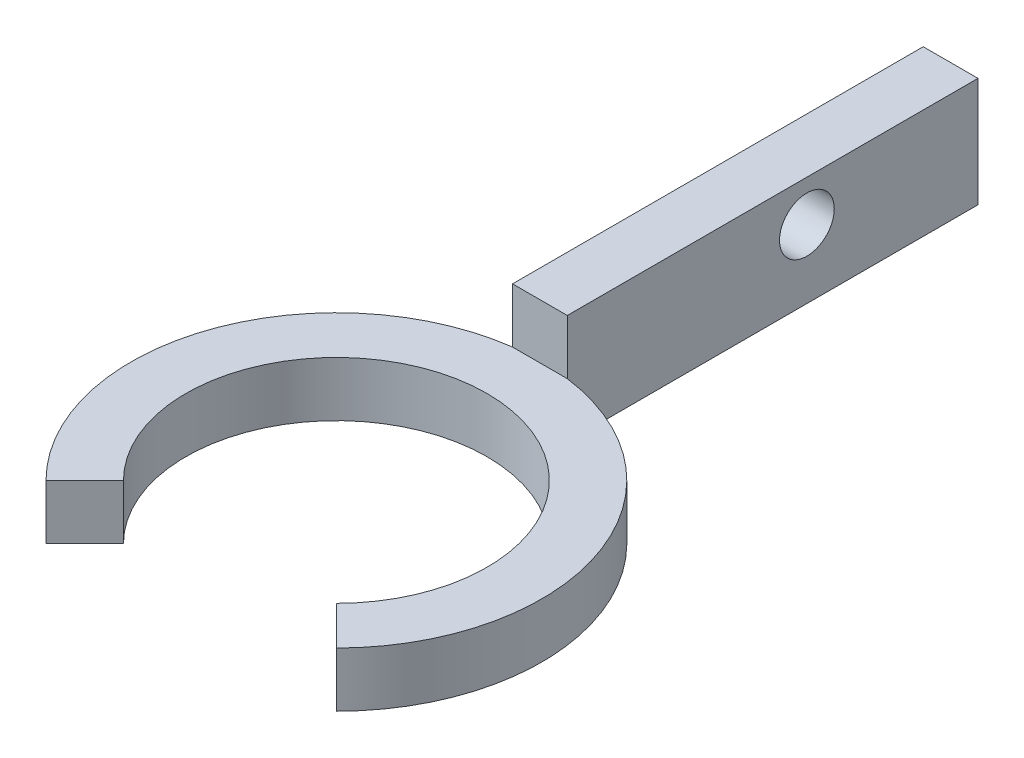
ISO-10303-21;
HEADER;
FILE_DESCRIPTION(('STEP AP214'),'2;1');
FILE_NAME('part.step','',(''),(''),'','','');
FILE_SCHEMA(('AUTOMOTIVE_DESIGN { 1 0 10303 214 1 1 1 1 }'));
ENDSEC;
DATA;
#1=APPLICATION_CONTEXT('core data for automotive mechanical design processes');
#2=APPLICATION_PROTOCOL_DEFINITION('international standard','automotive_design',2000,#1);
#3=PRODUCT_CONTEXT('',#1,'mechanical');
#4=PRODUCT('Part','Part','',(#3));
#5=PRODUCT_RELATED_PRODUCT_CATEGORY('part','',(#4));
#6=PRODUCT_DEFINITION_FORMATION('','',#4);
#7=PRODUCT_DEFINITION_CONTEXT('part definition',#1,'design');
#8=PRODUCT_DEFINITION('design','',#6,#7);
#9=PRODUCT_DEFINITION_SHAPE('','',#8);
#10=(LENGTH_UNIT() NAMED_UNIT(*) SI_UNIT(.MILLI.,.METRE.));
#11=(NAMED_UNIT(*) PLANE_ANGLE_UNIT() SI_UNIT($,.RADIAN.));
#12=(NAMED_UNIT(*) SI_UNIT($,.STERADIAN.) SOLID_ANGLE_UNIT());
#13=UNCERTAINTY_MEASURE_WITH_UNIT(LENGTH_MEASURE(1.E-05),#10,'distance_accuracy_value','');
#14=(GEOMETRIC_REPRESENTATION_CONTEXT(3) GLOBAL_UNCERTAINTY_ASSIGNED_CONTEXT((#13)) GLOBAL_UNIT_ASSIGNED_CONTEXT((#10,
#11,#12)) REPRESENTATION_CONTEXT('',''));
#15=CARTESIAN_POINT('',(0.,0.,0.));
#16=DIRECTION('',(0.,0.,1.));
#17=DIRECTION('',(1.,0.,0.));
#18=AXIS2_PLACEMENT_3D('',#15,#16,#17);
#19=CARTESIAN_POINT('',(0.,2.,0.));
#20=DIRECTION('',(0.,-1.,0.));
#21=DIRECTION('',(0.,0.,-1.));
#22=AXIS2_PLACEMENT_3D('',#19,#20,#21);
#23=CYLINDRICAL_SURFACE('',#22,7.5);
#24=DIRECTION('',(0.,-1.,0.));
#25=VECTOR('',#24,1.);
#26=CARTESIAN_POINT('',(-1.,4.,-7.43303437365925));
#27=LINE('',#26,#25);
#28=CARTESIAN_POINT('',(-0.999999999999999,2.,-7.43303437365925));
#29=VERTEX_POINT('',#28);
#30=CARTESIAN_POINT('',(-1.,0.,-7.43303437365925));
#31=VERTEX_POINT('',#30);
#32=EDGE_CURVE('E116',#29,#31,#27,.T.);
#33=ORIENTED_EDGE('',*,*,#32,.T.);
#34=CARTESIAN_POINT('',(0.,0.,0.));
#35=DIRECTION('',(0.,1.,0.));
#36=DIRECTION('',(0.,0.,1.));
#37=AXIS2_PLACEMENT_3D('',#34,#35,#36);
#38=CIRCLE('',#37,7.5);
#39=CARTESIAN_POINT('',(-5.30330085889908,0.,5.30330085889913));
#40=VERTEX_POINT('',#39);
#41=EDGE_CURVE('E131',#31,#40,#38,.T.);
#42=ORIENTED_EDGE('',*,*,#41,.T.);
#43=DIRECTION('',(0.,-1.,0.));
#44=VECTOR('',#43,1.);
#45=CARTESIAN_POINT('',(-5.30330085889908,2.,5.30330085889913));
#46=LINE('',#45,#44);
#47=CARTESIAN_POINT('',(-5.30330085889908,2.,5.30330085889913));
#48=VERTEX_POINT('',#47);
#49=EDGE_CURVE('E149',#48,#40,#46,.T.);
#50=ORIENTED_EDGE('',*,*,#49,.F.);
#51=CARTESIAN_POINT('',(0.,2.,0.));
#52=DIRECTION('',(0.,1.,0.));
#53=DIRECTION('',(0.,0.,1.));
#54=AXIS2_PLACEMENT_3D('',#51,#52,#53);
#55=CIRCLE('',#54,7.5);
#56=EDGE_CURVE('E132',#29,#48,#55,.T.);
#57=ORIENTED_EDGE('',*,*,#56,.F.);
#58=EDGE_LOOP('',(#33,#42,#50,#57));
#59=FACE_BOUND('',#58,.T.);
#60=ADVANCED_FACE('F34',(#59),#23,.T.);
#61=DIRECTION('',(0.,-1.,0.));
#62=VECTOR('',#61,1.);
#63=CARTESIAN_POINT('',(1.,4.,-7.43303437365925));
#64=LINE('',#63,#62);
#65=CARTESIAN_POINT('',(1.,2.,-7.43303437365925));
#66=VERTEX_POINT('',#65);
#67=CARTESIAN_POINT('',(1.,0.,-7.43303437365925));
#68=VERTEX_POINT('',#67);
#69=EDGE_CURVE('E179',#66,#68,#64,.T.);
#70=ORIENTED_EDGE('',*,*,#69,.F.);
#71=CARTESIAN_POINT('',(5.30330085889913,2.,5.30330085889908));
#72=VERTEX_POINT('',#71);
#73=EDGE_CURVE('E157',#72,#66,#55,.T.);
#74=ORIENTED_EDGE('',*,*,#73,.F.);
#75=DIRECTION('',(0.,-1.,0.));
#76=VECTOR('',#75,1.);
#77=CARTESIAN_POINT('',(5.30330085889913,2.,5.30330085889908));
#78=LINE('',#77,#76);
#79=CARTESIAN_POINT('',(5.30330085889913,0.,5.30330085889908));
#80=VERTEX_POINT('',#79);
#81=EDGE_CURVE('E42',#72,#80,#78,.T.);
#82=ORIENTED_EDGE('',*,*,#81,.T.);
#83=EDGE_CURVE('E137',#80,#68,#38,.T.);
#84=ORIENTED_EDGE('',*,*,#83,.T.);
#85=EDGE_LOOP('',(#70,#74,#82,#84));
#86=FACE_BOUND('',#85,.T.);
#87=ADVANCED_FACE('F155',(#86),#23,.T.);
#88=CARTESIAN_POINT('',(0.,2.,0.));
#89=DIRECTION('',(0.,1.,0.));
#90=DIRECTION('',(0.,0.,1.));
#91=AXIS2_PLACEMENT_3D('',#88,#89,#90);
#92=PLANE('',#91);
#93=ORIENTED_EDGE('',*,*,#73,.T.);
#94=DIRECTION('',(-1.,0.,0.));
#95=VECTOR('',#94,1.);
#96=CARTESIAN_POINT('',(0.,2.,-7.43303437365925));
#97=LINE('',#96,#95);
#98=EDGE_CURVE('E182',#66,#29,#97,.T.);
#99=ORIENTED_EDGE('',*,*,#98,.T.);
#100=ORIENTED_EDGE('',*,*,#56,.T.);
#101=DIRECTION('',(0.707106781186547,0.,-0.707106781186547));
#102=VECTOR('',#101,1.);
#103=CARTESIAN_POINT('',(-5.30330085889908,2.,5.30330085889913));
#104=LINE('',#103,#102);
#105=CARTESIAN_POINT('',(-3.88908729652598,2.,3.88908729652604));
#106=VERTEX_POINT('',#105);
#107=EDGE_CURVE('E58',#48,#106,#104,.T.);
#108=ORIENTED_EDGE('',*,*,#107,.T.);
#109=CARTESIAN_POINT('',(0.,2.,0.));
#110=DIRECTION('',(0.,-1.,0.));
#111=DIRECTION('',(0.,0.,1.));
#112=AXIS2_PLACEMENT_3D('',#109,#110,#111);
#113=CIRCLE('',#112,5.5);
#114=CARTESIAN_POINT('',(3.88908729652603,2.,3.88908729652599));
#115=VERTEX_POINT('',#114);
#116=EDGE_CURVE('E146',#106,#115,#113,.T.);
#117=ORIENTED_EDGE('',*,*,#116,.T.);
#118=DIRECTION('',(0.707106781186548,0.,0.707106781186547));
#119=VECTOR('',#118,1.);
#120=CARTESIAN_POINT('',(3.88908729652603,2.,3.88908729652599));
#121=LINE('',#120,#119);
#122=EDGE_CURVE('E86',#115,#72,#121,.T.);
#123=ORIENTED_EDGE('',*,*,#122,.T.);
#124=EDGE_LOOP('',(#93,#99,#100,#108,#117,#123));
#125=FACE_BOUND('',#124,.T.);
#126=ADVANCED_FACE('F205',(#125),#92,.T.);
#127=CARTESIAN_POINT('',(0.,2.,0.));
#128=DIRECTION('',(0.,-1.,0.));
#129=DIRECTION('',(0.,0.,-1.));
#130=AXIS2_PLACEMENT_3D('',#127,#128,#129);
#131=CYLINDRICAL_SURFACE('',#130,5.5);
#132=CARTESIAN_POINT('',(0.,0.,0.));
#133=DIRECTION('',(0.,-1.,0.));
#134=DIRECTION('',(0.,0.,1.));
#135=AXIS2_PLACEMENT_3D('',#132,#133,#134);
#136=CIRCLE('',#135,5.5);
#137=CARTESIAN_POINT('',(-3.88908729652598,0.,3.88908729652604));
#138=VERTEX_POINT('',#137);
#139=CARTESIAN_POINT('',(3.88908729652603,0.,3.88908729652599));
#140=VERTEX_POINT('',#139);
#141=EDGE_CURVE('E141',#138,#140,#136,.T.);
#142=ORIENTED_EDGE('',*,*,#141,.T.);
#143=DIRECTION('',(0.,-1.,0.));
#144=VECTOR('',#143,1.);
#145=CARTESIAN_POINT('',(3.88908729652603,2.,3.88908729652599));
#146=LINE('',#145,#144);
#147=EDGE_CURVE('E11',#115,#140,#146,.T.);
#148=ORIENTED_EDGE('',*,*,#147,.F.);
#149=ORIENTED_EDGE('',*,*,#116,.F.);
#150=DIRECTION('',(0.,-1.,0.));
#151=VECTOR('',#150,1.);
#152=CARTESIAN_POINT('',(-3.88908729652598,2.,3.88908729652604));
#153=LINE('',#152,#151);
#154=EDGE_CURVE('E147',#106,#138,#153,.T.);
#155=ORIENTED_EDGE('',*,*,#154,.T.);
#156=EDGE_LOOP('',(#142,#148,#149,#155));
#157=FACE_BOUND('',#156,.T.);
#158=ADVANCED_FACE('F36',(#157),#131,.F.);
#159=CARTESIAN_POINT('',(3.88908729652603,2.,3.88908729652599));
#160=DIRECTION('',(0.707106781186547,0.,-0.707106781186548));
#161=DIRECTION('',(-0.707106781186548,0.,-0.707106781186547));
#162=AXIS2_PLACEMENT_3D('',#159,#160,#161);
#163=PLANE('',#162);
#164=DIRECTION('',(0.707106781186548,0.,0.707106781186547));
#165=VECTOR('',#164,1.);
#166=CARTESIAN_POINT('',(3.88908729652603,0.,3.88908729652599));
#167=LINE('',#166,#165);
#168=EDGE_CURVE('E138',#140,#80,#167,.T.);
#169=ORIENTED_EDGE('',*,*,#168,.T.);
#170=ORIENTED_EDGE('',*,*,#81,.F.);
#171=ORIENTED_EDGE('',*,*,#122,.F.);
#172=ORIENTED_EDGE('',*,*,#147,.T.);
#173=EDGE_LOOP('',(#169,#170,#171,#172));
#174=FACE_BOUND('',#173,.T.);
#175=ADVANCED_FACE('F193',(#174),#163,.F.);
#176=CARTESIAN_POINT('',(-5.30330085889908,2.,5.30330085889913));
#177=DIRECTION('',(-0.707106781186547,0.,-0.707106781186547));
#178=DIRECTION('',(-0.707106781186548,0.,0.707106781186548));
#179=AXIS2_PLACEMENT_3D('',#176,#177,#178);
#180=PLANE('',#179);
#181=DIRECTION('',(0.707106781186547,0.,-0.707106781186547));
#182=VECTOR('',#181,1.);
#183=CARTESIAN_POINT('',(-5.30330085889908,0.,5.30330085889913));
#184=LINE('',#183,#182);
#185=EDGE_CURVE('E79',#40,#138,#184,.T.);
#186=ORIENTED_EDGE('',*,*,#185,.T.);
#187=ORIENTED_EDGE('',*,*,#154,.F.);
#188=ORIENTED_EDGE('',*,*,#107,.F.);
#189=ORIENTED_EDGE('',*,*,#49,.T.);
#190=EDGE_LOOP('',(#186,#187,#188,#189));
#191=FACE_BOUND('',#190,.T.);
#192=ADVANCED_FACE('F191',(#191),#180,.F.);
#193=CARTESIAN_POINT('',(0.,0.,0.));
#194=DIRECTION('',(0.,1.,0.));
#195=DIRECTION('',(0.,0.,1.));
#196=AXIS2_PLACEMENT_3D('',#193,#194,#195);
#197=PLANE('',#196);
#198=ORIENTED_EDGE('',*,*,#41,.F.);
#199=DIRECTION('',(0.,0.,1.));
#200=VECTOR('',#199,1.);
#201=CARTESIAN_POINT('',(-1.,0.,-7.43303437365925));
#202=LINE('',#201,#200);
#203=CARTESIAN_POINT('',(-1.,0.,-22.4330343736593));
#204=VERTEX_POINT('',#203);
#205=EDGE_CURVE('E113',#204,#31,#202,.T.);
#206=ORIENTED_EDGE('',*,*,#205,.F.);
#207=DIRECTION('',(-1.,0.,0.));
#208=VECTOR('',#207,1.);
#209=CARTESIAN_POINT('',(-1.,0.,-22.4330343736593));
#210=LINE('',#209,#208);
#211=CARTESIAN_POINT('',(1.,0.,-22.4330343736593));
#212=VERTEX_POINT('',#211);
#213=EDGE_CURVE('E160',#212,#204,#210,.T.);
#214=ORIENTED_EDGE('',*,*,#213,.F.);
#215=DIRECTION('',(0.,0.,-1.));
#216=VECTOR('',#215,1.);
#217=CARTESIAN_POINT('',(1.,0.,-7.43303437365925));
#218=LINE('',#217,#216);
#219=EDGE_CURVE('E125',#68,#212,#218,.T.);
#220=ORIENTED_EDGE('',*,*,#219,.F.);
#221=ORIENTED_EDGE('',*,*,#83,.F.);
#222=ORIENTED_EDGE('',*,*,#168,.F.);
#223=ORIENTED_EDGE('',*,*,#141,.F.);
#224=ORIENTED_EDGE('',*,*,#185,.F.);
#225=EDGE_LOOP('',(#198,#206,#214,#220,#221,#222,#223,#224));
#226=FACE_BOUND('',#225,.T.);
#227=ADVANCED_FACE('F135',(#226),#197,.F.);
#228=CARTESIAN_POINT('',(-1.,4.,-7.43303437365925));
#229=DIRECTION('',(1.,0.,0.));
#230=DIRECTION('',(0.,0.,-1.));
#231=AXIS2_PLACEMENT_3D('',#228,#229,#230);
#232=PLANE('',#231);
#233=CARTESIAN_POINT('',(-1.,2.5,-16.1830343736592));
#234=DIRECTION('',(1.,0.,0.));
#235=DIRECTION('',(0.,0.,-1.));
#236=AXIS2_PLACEMENT_3D('',#233,#234,#235);
#237=CIRCLE('',#236,1.);
#238=CARTESIAN_POINT('',(-1.,2.5,-17.1830343736593));
#239=VERTEX_POINT('',#238);
#240=EDGE_CURVE('E126',#239,#239,#237,.T.);
#241=ORIENTED_EDGE('',*,*,#240,.T.);
#242=EDGE_LOOP('',(#241));
#243=FACE_BOUND('',#242,.T.);
#244=DIRECTION('',(0.,-1.,0.));
#245=VECTOR('',#244,1.);
#246=CARTESIAN_POINT('',(-1.,4.,-22.4330343736593));
#247=LINE('',#246,#245);
#248=CARTESIAN_POINT('',(-1.,4.,-22.4330343736593));
#249=VERTEX_POINT('',#248);
#250=EDGE_CURVE('E120',#249,#204,#247,.T.);
#251=ORIENTED_EDGE('',*,*,#250,.T.);
#252=ORIENTED_EDGE('',*,*,#205,.T.);
#253=ORIENTED_EDGE('',*,*,#32,.F.);
#254=CARTESIAN_POINT('',(-1.,4.,-7.43303437365925));
#255=VERTEX_POINT('',#254);
#256=EDGE_CURVE('E49',#255,#29,#27,.T.);
#257=ORIENTED_EDGE('',*,*,#256,.F.);
#258=DIRECTION('',(0.,0.,1.));
#259=VECTOR('',#258,1.);
#260=CARTESIAN_POINT('',(-1.,4.,-7.43303437365925));
#261=LINE('',#260,#259);
#262=EDGE_CURVE('E164',#249,#255,#261,.T.);
#263=ORIENTED_EDGE('',*,*,#262,.F.);
#264=EDGE_LOOP('',(#251,#252,#253,#257,#263));
#265=FACE_BOUND('',#264,.T.);
#266=ADVANCED_FACE('F115',(#243,#265),#232,.F.);
#267=CARTESIAN_POINT('',(-1.,4.,-7.43303437365925));
#268=DIRECTION('',(0.,0.,-1.));
#269=DIRECTION('',(-1.,0.,0.));
#270=AXIS2_PLACEMENT_3D('',#267,#268,#269);
#271=PLANE('',#270);
#272=ORIENTED_EDGE('',*,*,#98,.F.);
#273=CARTESIAN_POINT('',(1.,4.,-7.43303437365925));
#274=VERTEX_POINT('',#273);
#275=EDGE_CURVE('E133',#274,#66,#64,.T.);
#276=ORIENTED_EDGE('',*,*,#275,.F.);
#277=DIRECTION('',(1.,0.,0.));
#278=VECTOR('',#277,1.);
#279=CARTESIAN_POINT('',(-1.,4.,-7.43303437365925));
#280=LINE('',#279,#278);
#281=EDGE_CURVE('E170',#255,#274,#280,.T.);
#282=ORIENTED_EDGE('',*,*,#281,.F.);
#283=ORIENTED_EDGE('',*,*,#256,.T.);
#284=EDGE_LOOP('',(#272,#276,#282,#283));
#285=FACE_BOUND('',#284,.T.);
#286=ADVANCED_FACE('F216',(#285),#271,.F.);
#287=CARTESIAN_POINT('',(1.,4.,-7.43303437365925));
#288=DIRECTION('',(-1.,0.,0.));
#289=DIRECTION('',(0.,0.,1.));
#290=AXIS2_PLACEMENT_3D('',#287,#288,#289);
#291=PLANE('',#290);
#292=CARTESIAN_POINT('',(1.,2.5,-16.1830343736592));
#293=DIRECTION('',(1.,0.,0.));
#294=DIRECTION('',(0.,0.,-1.));
#295=AXIS2_PLACEMENT_3D('',#292,#293,#294);
#296=CIRCLE('',#295,1.);
#297=CARTESIAN_POINT('',(1.,2.5,-17.1830343736593));
#298=VERTEX_POINT('',#297);
#299=EDGE_CURVE('E240',#298,#298,#296,.T.);
#300=ORIENTED_EDGE('',*,*,#299,.F.);
#301=EDGE_LOOP('',(#300));
#302=FACE_BOUND('',#301,.T.);
#303=ORIENTED_EDGE('',*,*,#275,.T.);
#304=ORIENTED_EDGE('',*,*,#69,.T.);
#305=ORIENTED_EDGE('',*,*,#219,.T.);
#306=DIRECTION('',(0.,-1.,0.));
#307=VECTOR('',#306,1.);
#308=CARTESIAN_POINT('',(1.,4.,-22.4330343736593));
#309=LINE('',#308,#307);
#310=CARTESIAN_POINT('',(1.,4.,-22.4330343736593));
#311=VERTEX_POINT('',#310);
#312=EDGE_CURVE('E177',#311,#212,#309,.T.);
#313=ORIENTED_EDGE('',*,*,#312,.F.);
#314=DIRECTION('',(0.,0.,-1.));
#315=VECTOR('',#314,1.);
#316=CARTESIAN_POINT('',(1.,4.,-7.43303437365925));
#317=LINE('',#316,#315);
#318=EDGE_CURVE('E172',#274,#311,#317,.T.);
#319=ORIENTED_EDGE('',*,*,#318,.F.);
#320=EDGE_LOOP('',(#303,#304,#305,#313,#319));
#321=FACE_BOUND('',#320,.T.);
#322=ADVANCED_FACE('F220',(#302,#321),#291,.F.);
#323=CARTESIAN_POINT('',(-1.,4.,-22.4330343736593));
#324=DIRECTION('',(0.,0.,1.));
#325=DIRECTION('',(1.,0.,0.));
#326=AXIS2_PLACEMENT_3D('',#323,#324,#325);
#327=PLANE('',#326);
#328=ORIENTED_EDGE('',*,*,#312,.T.);
#329=ORIENTED_EDGE('',*,*,#213,.T.);
#330=ORIENTED_EDGE('',*,*,#250,.F.);
#331=DIRECTION('',(-1.,0.,0.));
#332=VECTOR('',#331,1.);
#333=CARTESIAN_POINT('',(-1.,4.,-22.4330343736593));
#334=LINE('',#333,#332);
#335=EDGE_CURVE('E174',#311,#249,#334,.T.);
#336=ORIENTED_EDGE('',*,*,#335,.F.);
#337=EDGE_LOOP('',(#328,#329,#330,#336));
#338=FACE_BOUND('',#337,.T.);
#339=ADVANCED_FACE('F223',(#338),#327,.F.);
#340=CARTESIAN_POINT('',(0.,4.,0.));
#341=DIRECTION('',(0.,-1.,0.));
#342=DIRECTION('',(0.,0.,-1.));
#343=AXIS2_PLACEMENT_3D('',#340,#341,#342);
#344=PLANE('',#343);
#345=ORIENTED_EDGE('',*,*,#262,.T.);
#346=ORIENTED_EDGE('',*,*,#281,.T.);
#347=ORIENTED_EDGE('',*,*,#318,.T.);
#348=ORIENTED_EDGE('',*,*,#335,.T.);
#349=EDGE_LOOP('',(#345,#346,#347,#348));
#350=FACE_BOUND('',#349,.T.);
#351=ADVANCED_FACE('F227',(#350),#344,.F.);
#352=CARTESIAN_POINT('',(-7.5,2.5,-16.1830343736592));
#353=DIRECTION('',(1.,0.,0.));
#354=DIRECTION('',(0.,0.,-1.));
#355=AXIS2_PLACEMENT_3D('',#352,#353,#354);
#356=CYLINDRICAL_SURFACE('',#355,1.);
#357=ORIENTED_EDGE('',*,*,#299,.T.);
#358=EDGE_LOOP('',(#357));
#359=FACE_BOUND('',#358,.T.);
#360=ORIENTED_EDGE('',*,*,#240,.F.);
#361=EDGE_LOOP('',(#360));
#362=FACE_BOUND('',#361,.T.);
#363=ADVANCED_FACE('F231',(#359,#362),#356,.F.);
#364=CLOSED_SHELL('',(#60,#87,#126,#158,#175,#192,#227,#266,#286,#322,#339,#351,#363));
#365=MANIFOLD_SOLID_BREP('B2',#364);
#366=ADVANCED_BREP_SHAPE_REPRESENTATION('',(#18,#365),#14);
#367=SHAPE_DEFINITION_REPRESENTATION(#9,#366);
ENDSEC;
END-ISO-10303-21;
